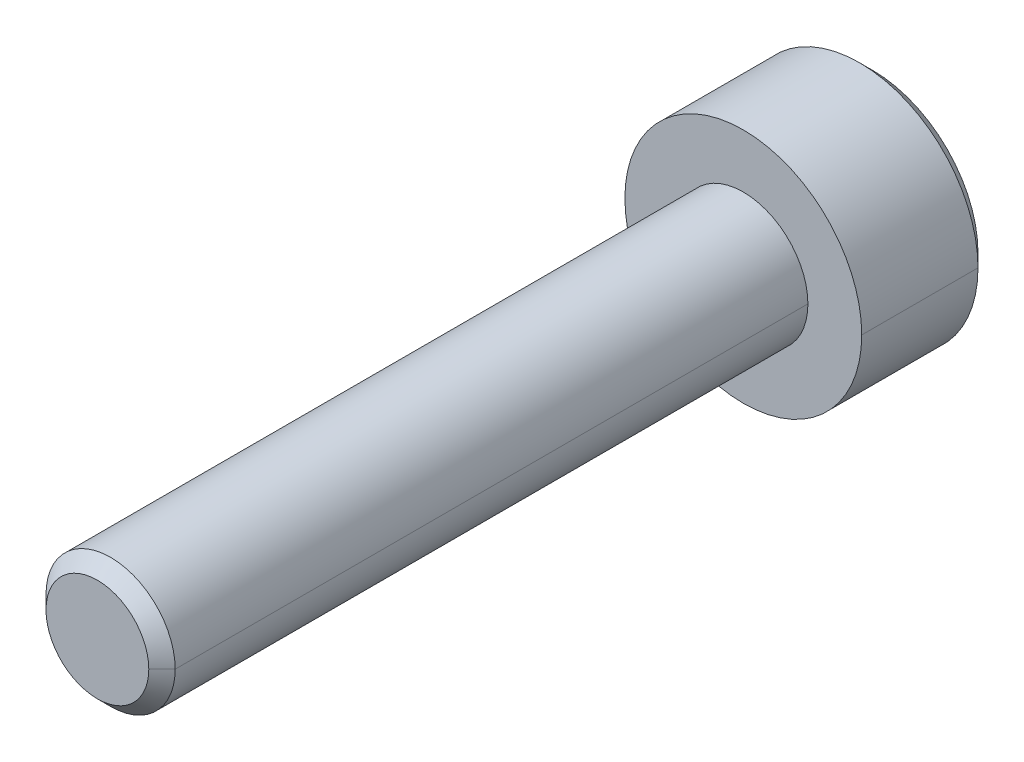
ISO-10303-21;
HEADER;
FILE_DESCRIPTION(('STEP AP214'),'2;1');
FILE_NAME('part.step','',(''),(''),'','','');
FILE_SCHEMA(('AUTOMOTIVE_DESIGN { 1 0 10303 214 1 1 1 1 }'));
ENDSEC;
DATA;
#1=APPLICATION_CONTEXT('core data for automotive mechanical design processes');
#2=APPLICATION_PROTOCOL_DEFINITION('international standard','automotive_design',2000,#1);
#3=PRODUCT_CONTEXT('',#1,'mechanical');
#4=PRODUCT('Part','Part','',(#3));
#5=PRODUCT_RELATED_PRODUCT_CATEGORY('part','',(#4));
#6=PRODUCT_DEFINITION_FORMATION('','',#4);
#7=PRODUCT_DEFINITION_CONTEXT('part definition',#1,'design');
#8=PRODUCT_DEFINITION('design','',#6,#7);
#9=PRODUCT_DEFINITION_SHAPE('','',#8);
#10=(LENGTH_UNIT() NAMED_UNIT(*) SI_UNIT(.MILLI.,.METRE.));
#11=(NAMED_UNIT(*) PLANE_ANGLE_UNIT() SI_UNIT($,.RADIAN.));
#12=(NAMED_UNIT(*) SI_UNIT($,.STERADIAN.) SOLID_ANGLE_UNIT());
#13=UNCERTAINTY_MEASURE_WITH_UNIT(LENGTH_MEASURE(1.E-05),#10,'distance_accuracy_value','');
#14=(GEOMETRIC_REPRESENTATION_CONTEXT(3) GLOBAL_UNCERTAINTY_ASSIGNED_CONTEXT((#13)) GLOBAL_UNIT_ASSIGNED_CONTEXT((#10,
#11,#12)) REPRESENTATION_CONTEXT('',''));
#15=CARTESIAN_POINT('',(0.,0.,0.));
#16=DIRECTION('',(0.,0.,1.));
#17=DIRECTION('',(1.,0.,0.));
#18=AXIS2_PLACEMENT_3D('',#15,#16,#17);
#19=CARTESIAN_POINT('',(0.,0.,1.3));
#20=DIRECTION('',(0.,0.,-1.));
#21=DIRECTION('',(0.,-1.,0.));
#22=AXIS2_PLACEMENT_3D('',#19,#20,#21);
#23=PLANE('',#22);
#24=DIRECTION('',(0.866025403784439,0.5,0.));
#25=VECTOR('',#24,1.);
#26=CARTESIAN_POINT('',(-1.25,0.721687836487033,1.3));
#27=LINE('',#26,#25);
#28=CARTESIAN_POINT('',(-1.25,0.721687836487033,1.3));
#29=VERTEX_POINT('',#28);
#30=CARTESIAN_POINT('',(0.,1.44337567297406,1.3));
#31=VERTEX_POINT('',#30);
#32=EDGE_CURVE('E176',#29,#31,#27,.T.);
#33=ORIENTED_EDGE('',*,*,#32,.T.);
#34=DIRECTION('',(0.866025403784439,-0.5,0.));
#35=VECTOR('',#34,1.);
#36=CARTESIAN_POINT('',(0.,1.44337567297406,1.3));
#37=LINE('',#36,#35);
#38=CARTESIAN_POINT('',(1.25,0.721687836487033,1.3));
#39=VERTEX_POINT('',#38);
#40=EDGE_CURVE('E9',#31,#39,#37,.T.);
#41=ORIENTED_EDGE('',*,*,#40,.T.);
#42=DIRECTION('',(0.,-1.,0.));
#43=VECTOR('',#42,1.);
#44=CARTESIAN_POINT('',(1.25,0.721687836487033,1.3));
#45=LINE('',#44,#43);
#46=CARTESIAN_POINT('',(1.25,-0.721687836487033,1.3));
#47=VERTEX_POINT('',#46);
#48=EDGE_CURVE('E44',#39,#47,#45,.T.);
#49=ORIENTED_EDGE('',*,*,#48,.T.);
#50=DIRECTION('',(-0.866025403784439,-0.5,0.));
#51=VECTOR('',#50,1.);
#52=CARTESIAN_POINT('',(1.25,-0.721687836487033,1.3));
#53=LINE('',#52,#51);
#54=CARTESIAN_POINT('',(0.,-1.44337567297406,1.3));
#55=VERTEX_POINT('',#54);
#56=EDGE_CURVE('E18',#47,#55,#53,.T.);
#57=ORIENTED_EDGE('',*,*,#56,.T.);
#58=DIRECTION('',(-0.866025403784439,0.5,0.));
#59=VECTOR('',#58,1.);
#60=CARTESIAN_POINT('',(0.,-1.44337567297406,1.3));
#61=LINE('',#60,#59);
#62=CARTESIAN_POINT('',(-1.25,-0.721687836487033,1.3));
#63=VERTEX_POINT('',#62);
#64=EDGE_CURVE('E183',#55,#63,#61,.T.);
#65=ORIENTED_EDGE('',*,*,#64,.T.);
#66=DIRECTION('',(0.,1.,0.));
#67=VECTOR('',#66,1.);
#68=CARTESIAN_POINT('',(-1.25,-0.721687836487033,1.3));
#69=LINE('',#68,#67);
#70=EDGE_CURVE('E182',#63,#29,#69,.T.);
#71=ORIENTED_EDGE('',*,*,#70,.T.);
#72=EDGE_LOOP('',(#33,#41,#49,#57,#65,#71));
#73=FACE_BOUND('',#72,.T.);
#74=ADVANCED_FACE('F15',(#73),#23,.T.);
#75=CARTESIAN_POINT('',(0.,1.44337567297406,1.3));
#76=DIRECTION('',(0.5,0.866025403784439,0.));
#77=DIRECTION('',(0.,0.,-1.));
#78=AXIS2_PLACEMENT_3D('',#75,#76,#77);
#79=PLANE('',#78);
#80=DIRECTION('',(0.866025403784439,-0.5,0.));
#81=VECTOR('',#80,1.);
#82=CARTESIAN_POINT('',(0.,1.44337567297406,0.));
#83=LINE('',#82,#81);
#84=CARTESIAN_POINT('',(0.,1.44337567297406,0.));
#85=VERTEX_POINT('',#84);
#86=CARTESIAN_POINT('',(1.25,0.721687836487033,0.));
#87=VERTEX_POINT('',#86);
#88=EDGE_CURVE('E240',#85,#87,#83,.T.);
#89=ORIENTED_EDGE('',*,*,#88,.T.);
#90=DIRECTION('',(0.,0.,-1.));
#91=VECTOR('',#90,1.);
#92=CARTESIAN_POINT('',(1.25,0.721687836487033,1.3));
#93=LINE('',#92,#91);
#94=EDGE_CURVE('E24',#39,#87,#93,.T.);
#95=ORIENTED_EDGE('',*,*,#94,.F.);
#96=ORIENTED_EDGE('',*,*,#40,.F.);
#97=DIRECTION('',(0.,0.,-1.));
#98=VECTOR('',#97,1.);
#99=CARTESIAN_POINT('',(0.,1.44337567297406,1.3));
#100=LINE('',#99,#98);
#101=EDGE_CURVE('E173',#31,#85,#100,.T.);
#102=ORIENTED_EDGE('',*,*,#101,.T.);
#103=EDGE_LOOP('',(#89,#95,#96,#102));
#104=FACE_BOUND('',#103,.T.);
#105=ADVANCED_FACE('F274',(#104),#79,.F.);
#106=CARTESIAN_POINT('',(1.25,0.721687836487033,1.3));
#107=DIRECTION('',(1.,0.,0.));
#108=DIRECTION('',(0.,1.,0.));
#109=AXIS2_PLACEMENT_3D('',#106,#107,#108);
#110=PLANE('',#109);
#111=DIRECTION('',(0.,-1.,0.));
#112=VECTOR('',#111,1.);
#113=CARTESIAN_POINT('',(1.25,0.721687836487033,0.));
#114=LINE('',#113,#112);
#115=CARTESIAN_POINT('',(1.25,-0.721687836487033,0.));
#116=VERTEX_POINT('',#115);
#117=EDGE_CURVE('E147',#87,#116,#114,.T.);
#118=ORIENTED_EDGE('',*,*,#117,.T.);
#119=DIRECTION('',(0.,0.,-1.));
#120=VECTOR('',#119,1.);
#121=CARTESIAN_POINT('',(1.25,-0.721687836487033,1.3));
#122=LINE('',#121,#120);
#123=EDGE_CURVE('E136',#47,#116,#122,.T.);
#124=ORIENTED_EDGE('',*,*,#123,.F.);
#125=ORIENTED_EDGE('',*,*,#48,.F.);
#126=ORIENTED_EDGE('',*,*,#94,.T.);
#127=EDGE_LOOP('',(#118,#124,#125,#126));
#128=FACE_BOUND('',#127,.T.);
#129=ADVANCED_FACE('F148',(#128),#110,.F.);
#130=CARTESIAN_POINT('',(1.25,-0.721687836487033,1.3));
#131=DIRECTION('',(0.5,-0.866025403784439,0.));
#132=DIRECTION('',(0.,0.,-1.));
#133=AXIS2_PLACEMENT_3D('',#130,#131,#132);
#134=PLANE('',#133);
#135=DIRECTION('',(-0.866025403784439,-0.5,0.));
#136=VECTOR('',#135,1.);
#137=CARTESIAN_POINT('',(1.25,-0.721687836487033,0.));
#138=LINE('',#137,#136);
#139=CARTESIAN_POINT('',(0.,-1.44337567297406,0.));
#140=VERTEX_POINT('',#139);
#141=EDGE_CURVE('E141',#116,#140,#138,.T.);
#142=ORIENTED_EDGE('',*,*,#141,.T.);
#143=DIRECTION('',(0.,0.,-1.));
#144=VECTOR('',#143,1.);
#145=CARTESIAN_POINT('',(0.,-1.44337567297406,1.3));
#146=LINE('',#145,#144);
#147=EDGE_CURVE('E185',#55,#140,#146,.T.);
#148=ORIENTED_EDGE('',*,*,#147,.F.);
#149=ORIENTED_EDGE('',*,*,#56,.F.);
#150=ORIENTED_EDGE('',*,*,#123,.T.);
#151=EDGE_LOOP('',(#142,#148,#149,#150));
#152=FACE_BOUND('',#151,.T.);
#153=ADVANCED_FACE('F138',(#152),#134,.F.);
#154=CARTESIAN_POINT('',(0.,-1.44337567297406,1.3));
#155=DIRECTION('',(-0.5,-0.866025403784439,0.));
#156=DIRECTION('',(-0.866025403784439,0.5,0.));
#157=AXIS2_PLACEMENT_3D('',#154,#155,#156);
#158=PLANE('',#157);
#159=DIRECTION('',(-0.866025403784439,0.5,0.));
#160=VECTOR('',#159,1.);
#161=CARTESIAN_POINT('',(0.,-1.44337567297406,0.));
#162=LINE('',#161,#160);
#163=CARTESIAN_POINT('',(-1.25,-0.721687836487033,0.));
#164=VERTEX_POINT('',#163);
#165=EDGE_CURVE('E159',#140,#164,#162,.T.);
#166=ORIENTED_EDGE('',*,*,#165,.T.);
#167=DIRECTION('',(0.,0.,-1.));
#168=VECTOR('',#167,1.);
#169=CARTESIAN_POINT('',(-1.25,-0.721687836487033,1.3));
#170=LINE('',#169,#168);
#171=EDGE_CURVE('E186',#63,#164,#170,.T.);
#172=ORIENTED_EDGE('',*,*,#171,.F.);
#173=ORIENTED_EDGE('',*,*,#64,.F.);
#174=ORIENTED_EDGE('',*,*,#147,.T.);
#175=EDGE_LOOP('',(#166,#172,#173,#174));
#176=FACE_BOUND('',#175,.T.);
#177=ADVANCED_FACE('F196',(#176),#158,.F.);
#178=CARTESIAN_POINT('',(-1.25,-0.721687836487033,1.3));
#179=DIRECTION('',(-1.,0.,0.));
#180=DIRECTION('',(0.,0.,1.));
#181=AXIS2_PLACEMENT_3D('',#178,#179,#180);
#182=PLANE('',#181);
#183=DIRECTION('',(0.,1.,0.));
#184=VECTOR('',#183,1.);
#185=CARTESIAN_POINT('',(-1.25,-0.721687836487033,0.));
#186=LINE('',#185,#184);
#187=CARTESIAN_POINT('',(-1.25,0.721687836487033,0.));
#188=VERTEX_POINT('',#187);
#189=EDGE_CURVE('E166',#164,#188,#186,.T.);
#190=ORIENTED_EDGE('',*,*,#189,.T.);
#191=DIRECTION('',(0.,0.,-1.));
#192=VECTOR('',#191,1.);
#193=CARTESIAN_POINT('',(-1.25,0.721687836487033,1.3));
#194=LINE('',#193,#192);
#195=EDGE_CURVE('E179',#29,#188,#194,.T.);
#196=ORIENTED_EDGE('',*,*,#195,.F.);
#197=ORIENTED_EDGE('',*,*,#70,.F.);
#198=ORIENTED_EDGE('',*,*,#171,.T.);
#199=EDGE_LOOP('',(#190,#196,#197,#198));
#200=FACE_BOUND('',#199,.T.);
#201=ADVANCED_FACE('F203',(#200),#182,.F.);
#202=CARTESIAN_POINT('',(-1.25,0.721687836487033,1.3));
#203=DIRECTION('',(-0.5,0.866025403784439,0.));
#204=DIRECTION('',(0.,0.,1.));
#205=AXIS2_PLACEMENT_3D('',#202,#203,#204);
#206=PLANE('',#205);
#207=DIRECTION('',(0.866025403784439,0.5,0.));
#208=VECTOR('',#207,1.);
#209=CARTESIAN_POINT('',(-1.25,0.721687836487033,0.));
#210=LINE('',#209,#208);
#211=EDGE_CURVE('E263',#188,#85,#210,.T.);
#212=ORIENTED_EDGE('',*,*,#211,.T.);
#213=ORIENTED_EDGE('',*,*,#101,.F.);
#214=ORIENTED_EDGE('',*,*,#32,.F.);
#215=ORIENTED_EDGE('',*,*,#195,.T.);
#216=EDGE_LOOP('',(#212,#213,#214,#215));
#217=FACE_BOUND('',#216,.T.);
#218=ADVANCED_FACE('F272',(#217),#206,.F.);
#219=CARTESIAN_POINT('',(0.,0.,18.));
#220=DIRECTION('',(0.,0.,-1.));
#221=DIRECTION('',(-1.,0.,0.));
#222=AXIS2_PLACEMENT_3D('',#219,#220,#221);
#223=CONICAL_SURFACE('',#222,1.1935,0.785398163397452);
#224=DIRECTION('',(0.707106781186551,0.,-0.707106781186545));
#225=VECTOR('',#224,1.);
#226=CARTESIAN_POINT('',(1.1935,0.,18.));
#227=LINE('',#226,#225);
#228=CARTESIAN_POINT('',(1.1935,0.,18.));
#229=VERTEX_POINT('',#228);
#230=CARTESIAN_POINT('',(1.5,0.,17.6935));
#231=VERTEX_POINT('',#230);
#232=EDGE_CURVE('E282',#229,#231,#227,.T.);
#233=ORIENTED_EDGE('',*,*,#232,.F.);
#234=CARTESIAN_POINT('',(0.,0.,18.));
#235=DIRECTION('',(0.,0.,1.));
#236=DIRECTION('',(1.,0.,0.));
#237=AXIS2_PLACEMENT_3D('',#234,#235,#236);
#238=CIRCLE('',#237,1.1935);
#239=CARTESIAN_POINT('',(-1.1935,0.,18.));
#240=VERTEX_POINT('',#239);
#241=EDGE_CURVE('E172',#240,#229,#238,.T.);
#242=ORIENTED_EDGE('',*,*,#241,.F.);
#243=DIRECTION('',(-0.707106781186551,0.,-0.707106781186545));
#244=VECTOR('',#243,1.);
#245=CARTESIAN_POINT('',(-1.1935,0.,18.));
#246=LINE('',#245,#244);
#247=CARTESIAN_POINT('',(-1.5,0.,17.6935));
#248=VERTEX_POINT('',#247);
#249=EDGE_CURVE('E224',#240,#248,#246,.T.);
#250=ORIENTED_EDGE('',*,*,#249,.T.);
#251=CARTESIAN_POINT('',(0.,0.,17.6935));
#252=DIRECTION('',(0.,0.,-1.));
#253=DIRECTION('',(1.,0.,0.));
#254=AXIS2_PLACEMENT_3D('',#251,#252,#253);
#255=CIRCLE('',#254,1.5);
#256=EDGE_CURVE('E153',#231,#248,#255,.T.);
#257=ORIENTED_EDGE('',*,*,#256,.F.);
#258=EDGE_LOOP('',(#233,#242,#250,#257));
#259=FACE_BOUND('',#258,.T.);
#260=ADVANCED_FACE('F348',(#259),#223,.T.);
#261=CARTESIAN_POINT('',(0.,0.,0.3));
#262=DIRECTION('',(0.,0.,1.));
#263=DIRECTION('',(1.,0.,0.));
#264=AXIS2_PLACEMENT_3D('',#261,#262,#263);
#265=CONICAL_SURFACE('',#264,2.75,0.785398163397447);
#266=DIRECTION('',(-0.707106781186546,0.,0.707106781186549));
#267=VECTOR('',#266,1.);
#268=CARTESIAN_POINT('',(-2.75,0.,0.3));
#269=LINE('',#268,#267);
#270=CARTESIAN_POINT('',(-2.45,0.,0.));
#271=VERTEX_POINT('',#270);
#272=CARTESIAN_POINT('',(-2.75,0.,0.3));
#273=VERTEX_POINT('',#272);
#274=EDGE_CURVE('E213',#271,#273,#269,.T.);
#275=ORIENTED_EDGE('',*,*,#274,.F.);
#276=CARTESIAN_POINT('',(0.,0.,0.));
#277=DIRECTION('',(0.,0.,-1.));
#278=DIRECTION('',(1.,0.,0.));
#279=AXIS2_PLACEMENT_3D('',#276,#277,#278);
#280=CIRCLE('',#279,2.45);
#281=CARTESIAN_POINT('',(2.45,0.,0.));
#282=VERTEX_POINT('',#281);
#283=EDGE_CURVE('E237',#282,#271,#280,.T.);
#284=ORIENTED_EDGE('',*,*,#283,.F.);
#285=DIRECTION('',(0.707106781186546,0.,0.707106781186549));
#286=VECTOR('',#285,1.);
#287=CARTESIAN_POINT('',(2.75,0.,0.3));
#288=LINE('',#287,#286);
#289=CARTESIAN_POINT('',(2.75,0.,0.3));
#290=VERTEX_POINT('',#289);
#291=EDGE_CURVE('E228',#282,#290,#288,.T.);
#292=ORIENTED_EDGE('',*,*,#291,.T.);
#293=CARTESIAN_POINT('',(0.,0.,0.3));
#294=DIRECTION('',(0.,0.,1.));
#295=DIRECTION('',(1.,0.,0.));
#296=AXIS2_PLACEMENT_3D('',#293,#294,#295);
#297=CIRCLE('',#296,2.75);
#298=EDGE_CURVE('E259',#273,#290,#297,.T.);
#299=ORIENTED_EDGE('',*,*,#298,.F.);
#300=EDGE_LOOP('',(#275,#284,#292,#299));
#301=FACE_BOUND('',#300,.T.);
#302=ADVANCED_FACE('F314',(#301),#265,.T.);
#303=CARTESIAN_POINT('',(0.,0.,18.));
#304=DIRECTION('',(0.,0.,1.));
#305=DIRECTION('',(1.,0.,0.));
#306=AXIS2_PLACEMENT_3D('',#303,#304,#305);
#307=PLANE('',#306);
#308=ORIENTED_EDGE('',*,*,#241,.T.);
#309=CARTESIAN_POINT('',(0.,0.,18.));
#310=DIRECTION('',(0.,0.,1.));
#311=DIRECTION('',(1.,0.,0.));
#312=AXIS2_PLACEMENT_3D('',#309,#310,#311);
#313=CIRCLE('',#312,1.1935);
#314=EDGE_CURVE('E287',#229,#240,#313,.T.);
#315=ORIENTED_EDGE('',*,*,#314,.T.);
#316=EDGE_LOOP('',(#308,#315));
#317=FACE_BOUND('',#316,.T.);
#318=ADVANCED_FACE('F329',(#317),#307,.T.);
#319=CARTESIAN_POINT('',(0.,0.,18.));
#320=DIRECTION('',(0.,0.,-1.));
#321=DIRECTION('',(-1.,0.,0.));
#322=AXIS2_PLACEMENT_3D('',#319,#320,#321);
#323=CYLINDRICAL_SURFACE('',#322,1.5);
#324=DIRECTION('',(0.,0.,-1.));
#325=VECTOR('',#324,1.);
#326=CARTESIAN_POINT('',(1.5,0.,18.));
#327=LINE('',#326,#325);
#328=CARTESIAN_POINT('',(1.5,0.,3.));
#329=VERTEX_POINT('',#328);
#330=EDGE_CURVE('E232',#231,#329,#327,.T.);
#331=ORIENTED_EDGE('',*,*,#330,.F.);
#332=ORIENTED_EDGE('',*,*,#256,.T.);
#333=DIRECTION('',(0.,0.,-1.));
#334=VECTOR('',#333,1.);
#335=CARTESIAN_POINT('',(-1.5,0.,18.));
#336=LINE('',#335,#334);
#337=CARTESIAN_POINT('',(-1.5,0.,3.));
#338=VERTEX_POINT('',#337);
#339=EDGE_CURVE('E245',#248,#338,#336,.T.);
#340=ORIENTED_EDGE('',*,*,#339,.T.);
#341=CARTESIAN_POINT('',(0.,0.,3.));
#342=DIRECTION('',(0.,0.,1.));
#343=DIRECTION('',(1.,0.,0.));
#344=AXIS2_PLACEMENT_3D('',#341,#342,#343);
#345=CIRCLE('',#344,1.5);
#346=EDGE_CURVE('E241',#338,#329,#345,.T.);
#347=ORIENTED_EDGE('',*,*,#346,.T.);
#348=EDGE_LOOP('',(#331,#332,#340,#347));
#349=FACE_BOUND('',#348,.T.);
#350=ADVANCED_FACE('F320',(#349),#323,.T.);
#351=CARTESIAN_POINT('',(0.,0.,0.));
#352=DIRECTION('',(0.,0.,1.));
#353=DIRECTION('',(1.,0.,0.));
#354=AXIS2_PLACEMENT_3D('',#351,#352,#353);
#355=PLANE('',#354);
#356=ORIENTED_EDGE('',*,*,#88,.F.);
#357=ORIENTED_EDGE('',*,*,#211,.F.);
#358=ORIENTED_EDGE('',*,*,#189,.F.);
#359=ORIENTED_EDGE('',*,*,#165,.F.);
#360=ORIENTED_EDGE('',*,*,#141,.F.);
#361=ORIENTED_EDGE('',*,*,#117,.F.);
#362=EDGE_LOOP('',(#356,#357,#358,#359,#360,#361));
#363=FACE_BOUND('',#362,.T.);
#364=ORIENTED_EDGE('',*,*,#283,.T.);
#365=CARTESIAN_POINT('',(0.,0.,0.));
#366=DIRECTION('',(0.,0.,-1.));
#367=DIRECTION('',(1.,0.,0.));
#368=AXIS2_PLACEMENT_3D('',#365,#366,#367);
#369=CIRCLE('',#368,2.45);
#370=EDGE_CURVE('E218',#271,#282,#369,.T.);
#371=ORIENTED_EDGE('',*,*,#370,.T.);
#372=EDGE_LOOP('',(#364,#371));
#373=FACE_BOUND('',#372,.T.);
#374=ADVANCED_FACE('F155',(#363,#373),#355,.F.);
#375=CARTESIAN_POINT('',(0.,0.,3.));
#376=DIRECTION('',(0.,0.,1.));
#377=DIRECTION('',(1.,0.,0.));
#378=AXIS2_PLACEMENT_3D('',#375,#376,#377);
#379=PLANE('',#378);
#380=ORIENTED_EDGE('',*,*,#346,.F.);
#381=CARTESIAN_POINT('',(0.,0.,3.));
#382=DIRECTION('',(0.,0.,1.));
#383=DIRECTION('',(1.,0.,0.));
#384=AXIS2_PLACEMENT_3D('',#381,#382,#383);
#385=CIRCLE('',#384,1.5);
#386=EDGE_CURVE('E235',#329,#338,#385,.T.);
#387=ORIENTED_EDGE('',*,*,#386,.F.);
#388=EDGE_LOOP('',(#380,#387));
#389=FACE_BOUND('',#388,.T.);
#390=CARTESIAN_POINT('',(0.,0.,3.));
#391=DIRECTION('',(0.,0.,1.));
#392=DIRECTION('',(1.,0.,0.));
#393=AXIS2_PLACEMENT_3D('',#390,#391,#392);
#394=CIRCLE('',#393,2.75);
#395=CARTESIAN_POINT('',(-2.75,0.,3.));
#396=VERTEX_POINT('',#395);
#397=CARTESIAN_POINT('',(2.75,0.,3.));
#398=VERTEX_POINT('',#397);
#399=EDGE_CURVE('E257',#396,#398,#394,.T.);
#400=ORIENTED_EDGE('',*,*,#399,.T.);
#401=CARTESIAN_POINT('',(0.,0.,3.));
#402=DIRECTION('',(0.,0.,1.));
#403=DIRECTION('',(1.,0.,0.));
#404=AXIS2_PLACEMENT_3D('',#401,#402,#403);
#405=CIRCLE('',#404,2.75);
#406=EDGE_CURVE('E248',#398,#396,#405,.T.);
#407=ORIENTED_EDGE('',*,*,#406,.T.);
#408=EDGE_LOOP('',(#400,#407));
#409=FACE_BOUND('',#408,.T.);
#410=ADVANCED_FACE('F319',(#389,#409),#379,.T.);
#411=CARTESIAN_POINT('',(0.,0.,3.));
#412=DIRECTION('',(0.,0.,-1.));
#413=DIRECTION('',(-1.,0.,0.));
#414=AXIS2_PLACEMENT_3D('',#411,#412,#413);
#415=CYLINDRICAL_SURFACE('',#414,2.75);
#416=DIRECTION('',(0.,0.,-1.));
#417=VECTOR('',#416,1.);
#418=CARTESIAN_POINT('',(2.75,0.,3.));
#419=LINE('',#418,#417);
#420=EDGE_CURVE('E211',#398,#290,#419,.T.);
#421=ORIENTED_EDGE('',*,*,#420,.F.);
#422=ORIENTED_EDGE('',*,*,#399,.F.);
#423=DIRECTION('',(0.,0.,-1.));
#424=VECTOR('',#423,1.);
#425=CARTESIAN_POINT('',(-2.75,0.,3.));
#426=LINE('',#425,#424);
#427=EDGE_CURVE('E253',#396,#273,#426,.T.);
#428=ORIENTED_EDGE('',*,*,#427,.T.);
#429=ORIENTED_EDGE('',*,*,#298,.T.);
#430=EDGE_LOOP('',(#421,#422,#428,#429));
#431=FACE_BOUND('',#430,.T.);
#432=ADVANCED_FACE('F304',(#431),#415,.T.);
#433=CARTESIAN_POINT('',(0.,0.,3.));
#434=DIRECTION('',(0.,0.,-1.));
#435=DIRECTION('',(-1.,0.,0.));
#436=AXIS2_PLACEMENT_3D('',#433,#434,#435);
#437=CYLINDRICAL_SURFACE('',#436,2.75);
#438=ORIENTED_EDGE('',*,*,#406,.F.);
#439=ORIENTED_EDGE('',*,*,#420,.T.);
#440=CARTESIAN_POINT('',(0.,0.,0.3));
#441=DIRECTION('',(0.,0.,1.));
#442=DIRECTION('',(1.,0.,0.));
#443=AXIS2_PLACEMENT_3D('',#440,#441,#442);
#444=CIRCLE('',#443,2.75);
#445=EDGE_CURVE('E217',#290,#273,#444,.T.);
#446=ORIENTED_EDGE('',*,*,#445,.T.);
#447=ORIENTED_EDGE('',*,*,#427,.F.);
#448=EDGE_LOOP('',(#438,#439,#446,#447));
#449=FACE_BOUND('',#448,.T.);
#450=ADVANCED_FACE('F310',(#449),#437,.T.);
#451=CARTESIAN_POINT('',(0.,0.,18.));
#452=DIRECTION('',(0.,0.,-1.));
#453=DIRECTION('',(-1.,0.,0.));
#454=AXIS2_PLACEMENT_3D('',#451,#452,#453);
#455=CYLINDRICAL_SURFACE('',#454,1.5);
#456=CARTESIAN_POINT('',(0.,0.,17.6935));
#457=DIRECTION('',(0.,0.,-1.));
#458=DIRECTION('',(1.,0.,0.));
#459=AXIS2_PLACEMENT_3D('',#456,#457,#458);
#460=CIRCLE('',#459,1.5);
#461=EDGE_CURVE('E286',#248,#231,#460,.T.);
#462=ORIENTED_EDGE('',*,*,#461,.T.);
#463=ORIENTED_EDGE('',*,*,#330,.T.);
#464=ORIENTED_EDGE('',*,*,#386,.T.);
#465=ORIENTED_EDGE('',*,*,#339,.F.);
#466=EDGE_LOOP('',(#462,#463,#464,#465));
#467=FACE_BOUND('',#466,.T.);
#468=ADVANCED_FACE('F360',(#467),#455,.T.);
#469=CARTESIAN_POINT('',(0.,0.,0.3));
#470=DIRECTION('',(0.,0.,1.));
#471=DIRECTION('',(1.,0.,0.));
#472=AXIS2_PLACEMENT_3D('',#469,#470,#471);
#473=CONICAL_SURFACE('',#472,2.75,0.785398163397447);
#474=ORIENTED_EDGE('',*,*,#370,.F.);
#475=ORIENTED_EDGE('',*,*,#274,.T.);
#476=ORIENTED_EDGE('',*,*,#445,.F.);
#477=ORIENTED_EDGE('',*,*,#291,.F.);
#478=EDGE_LOOP('',(#474,#475,#476,#477));
#479=FACE_BOUND('',#478,.T.);
#480=ADVANCED_FACE('F317',(#479),#473,.T.);
#481=CARTESIAN_POINT('',(0.,0.,18.));
#482=DIRECTION('',(0.,0.,-1.));
#483=DIRECTION('',(-1.,0.,0.));
#484=AXIS2_PLACEMENT_3D('',#481,#482,#483);
#485=CONICAL_SURFACE('',#484,1.1935,0.785398163397452);
#486=ORIENTED_EDGE('',*,*,#314,.F.);
#487=ORIENTED_EDGE('',*,*,#232,.T.);
#488=ORIENTED_EDGE('',*,*,#461,.F.);
#489=ORIENTED_EDGE('',*,*,#249,.F.);
#490=EDGE_LOOP('',(#486,#487,#488,#489));
#491=FACE_BOUND('',#490,.T.);
#492=ADVANCED_FACE('F366',(#491),#485,.T.);
#493=CLOSED_SHELL('',(#74,#105,#129,#153,#177,#201,#218,#260,#302,#318,#350,#374,#410,#432,#450,
#468,#480,#492));
#494=MANIFOLD_SOLID_BREP('B1',#493);
#495=ADVANCED_BREP_SHAPE_REPRESENTATION('',(#18,#494),#14);
#496=SHAPE_DEFINITION_REPRESENTATION(#9,#495);
ENDSEC;
END-ISO-10303-21;
